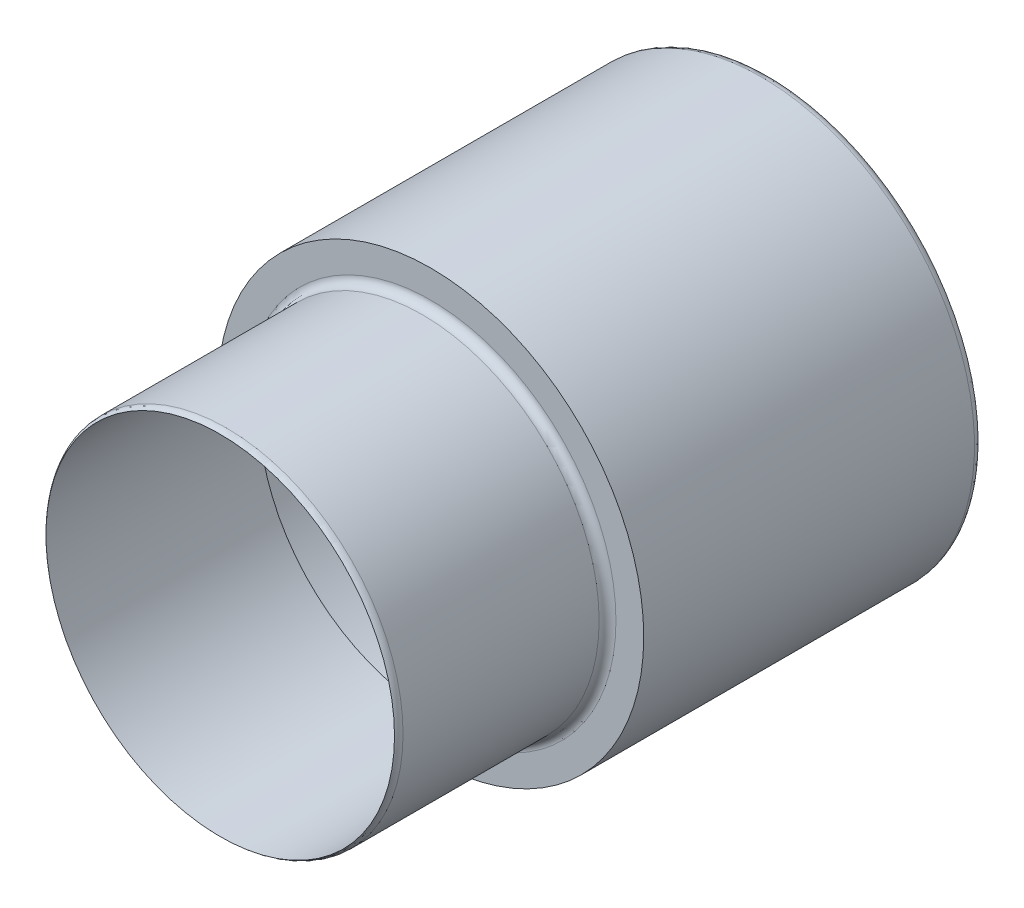
ISO-10303-21;
HEADER;
FILE_DESCRIPTION(('STEP AP214'),'2;1');
FILE_NAME('part.step','',(''),(''),'','','');
FILE_SCHEMA(('AUTOMOTIVE_DESIGN { 1 0 10303 214 1 1 1 1 }'));
ENDSEC;
DATA;
#1=APPLICATION_CONTEXT('core data for automotive mechanical design processes');
#2=APPLICATION_PROTOCOL_DEFINITION('international standard','automotive_design',2000,#1);
#3=PRODUCT_CONTEXT('',#1,'mechanical');
#4=PRODUCT('Part','Part','',(#3));
#5=PRODUCT_RELATED_PRODUCT_CATEGORY('part','',(#4));
#6=PRODUCT_DEFINITION_FORMATION('','',#4);
#7=PRODUCT_DEFINITION_CONTEXT('part definition',#1,'design');
#8=PRODUCT_DEFINITION('design','',#6,#7);
#9=PRODUCT_DEFINITION_SHAPE('','',#8);
#10=(LENGTH_UNIT() NAMED_UNIT(*) SI_UNIT(.MILLI.,.METRE.));
#11=(NAMED_UNIT(*) PLANE_ANGLE_UNIT() SI_UNIT($,.RADIAN.));
#12=(NAMED_UNIT(*) SI_UNIT($,.STERADIAN.) SOLID_ANGLE_UNIT());
#13=UNCERTAINTY_MEASURE_WITH_UNIT(LENGTH_MEASURE(1.E-05),#10,'distance_accuracy_value','');
#14=(GEOMETRIC_REPRESENTATION_CONTEXT(3) GLOBAL_UNCERTAINTY_ASSIGNED_CONTEXT((#13)) GLOBAL_UNIT_ASSIGNED_CONTEXT((#10,
#11,#12)) REPRESENTATION_CONTEXT('',''));
#15=CARTESIAN_POINT('',(0.,0.,0.));
#16=DIRECTION('',(0.,0.,1.));
#17=DIRECTION('',(1.,0.,0.));
#18=AXIS2_PLACEMENT_3D('',#15,#16,#17);
#19=CARTESIAN_POINT('',(0.,0.,400.));
#20=DIRECTION('',(0.,0.,-1.));
#21=DIRECTION('',(-1.,0.,0.));
#22=AXIS2_PLACEMENT_3D('',#19,#20,#21);
#23=CYLINDRICAL_SURFACE('',#22,253.);
#24=CARTESIAN_POINT('',(0.,0.,7.14142842854282));
#25=DIRECTION('',(0.,0.,-1.));
#26=DIRECTION('',(-1.,0.,0.));
#27=AXIS2_PLACEMENT_3D('',#24,#25,#26);
#28=CIRCLE('',#27,253.);
#29=CARTESIAN_POINT('',(-253.,0.,7.14142842854282));
#30=VERTEX_POINT('',#29);
#31=EDGE_CURVE('E10',#30,#30,#28,.F.);
#32=ORIENTED_EDGE('',*,*,#31,.T.);
#33=EDGE_LOOP('',(#32));
#34=FACE_BOUND('',#33,.T.);
#35=CARTESIAN_POINT('',(0.,0.,400.));
#36=DIRECTION('',(0.,0.,1.));
#37=DIRECTION('',(1.,0.,0.));
#38=AXIS2_PLACEMENT_3D('',#35,#36,#37);
#39=CIRCLE('',#38,253.);
#40=CARTESIAN_POINT('',(253.,0.,400.));
#41=VERTEX_POINT('',#40);
#42=EDGE_CURVE('E52',#41,#41,#39,.T.);
#43=ORIENTED_EDGE('',*,*,#42,.F.);
#44=EDGE_LOOP('',(#43));
#45=FACE_BOUND('',#44,.T.);
#46=ADVANCED_FACE('F32',(#34,#45),#23,.T.);
#47=CARTESIAN_POINT('',(0.,0.,400.));
#48=DIRECTION('',(0.,0.,1.));
#49=DIRECTION('',(1.,0.,0.));
#50=AXIS2_PLACEMENT_3D('',#47,#48,#49);
#51=PLANE('',#50);
#52=CARTESIAN_POINT('',(0.,0.,400.));
#53=DIRECTION('',(0.,0.,1.));
#54=DIRECTION('',(1.,0.,0.));
#55=AXIS2_PLACEMENT_3D('',#52,#53,#54);
#56=CIRCLE('',#55,220.);
#57=CARTESIAN_POINT('',(220.,0.,400.));
#58=VERTEX_POINT('',#57);
#59=EDGE_CURVE('E39',#58,#58,#56,.F.);
#60=ORIENTED_EDGE('',*,*,#59,.T.);
#61=EDGE_LOOP('',(#60));
#62=FACE_BOUND('',#61,.T.);
#63=ORIENTED_EDGE('',*,*,#42,.T.);
#64=EDGE_LOOP('',(#63));
#65=FACE_BOUND('',#64,.T.);
#66=ADVANCED_FACE('F86',(#62,#65),#51,.T.);
#67=CARTESIAN_POINT('',(0.,0.,650.));
#68=DIRECTION('',(0.,0.,-1.));
#69=DIRECTION('',(-1.,0.,0.));
#70=AXIS2_PLACEMENT_3D('',#67,#68,#69);
#71=CYLINDRICAL_SURFACE('',#70,210.);
#72=CARTESIAN_POINT('',(0.,0.,410.));
#73=DIRECTION('',(0.,0.,1.));
#74=DIRECTION('',(1.,0.,0.));
#75=AXIS2_PLACEMENT_3D('',#72,#73,#74);
#76=CIRCLE('',#75,210.);
#77=CARTESIAN_POINT('',(210.,0.,410.));
#78=VERTEX_POINT('',#77);
#79=EDGE_CURVE('E43',#78,#78,#76,.T.);
#80=ORIENTED_EDGE('',*,*,#79,.T.);
#81=EDGE_LOOP('',(#80));
#82=FACE_BOUND('',#81,.T.);
#83=CARTESIAN_POINT('',(0.,0.,642.858571571457));
#84=DIRECTION('',(0.,0.,1.));
#85=DIRECTION('',(1.,0.,0.));
#86=AXIS2_PLACEMENT_3D('',#83,#84,#85);
#87=CIRCLE('',#86,210.);
#88=CARTESIAN_POINT('',(210.,0.,642.858571571457));
#89=VERTEX_POINT('',#88);
#90=EDGE_CURVE('E47',#89,#89,#87,.F.);
#91=ORIENTED_EDGE('',*,*,#90,.T.);
#92=EDGE_LOOP('',(#91));
#93=FACE_BOUND('',#92,.T.);
#94=ADVANCED_FACE('F83',(#82,#93),#71,.T.);
#95=CARTESIAN_POINT('',(0.,0.,400.));
#96=DIRECTION('',(0.,0.,-1.));
#97=DIRECTION('',(-1.,0.,0.));
#98=AXIS2_PLACEMENT_3D('',#95,#96,#97);
#99=CYLINDRICAL_SURFACE('',#98,250.);
#100=CARTESIAN_POINT('',(0.,0.,397.));
#101=DIRECTION('',(0.,0.,1.));
#102=DIRECTION('',(1.,0.,0.));
#103=AXIS2_PLACEMENT_3D('',#100,#101,#102);
#104=CIRCLE('',#103,250.);
#105=CARTESIAN_POINT('',(250.,0.,397.));
#106=VERTEX_POINT('',#105);
#107=EDGE_CURVE('E62',#106,#106,#104,.T.);
#108=ORIENTED_EDGE('',*,*,#107,.T.);
#109=EDGE_LOOP('',(#108));
#110=FACE_BOUND('',#109,.T.);
#111=CARTESIAN_POINT('',(0.,0.,0.));
#112=DIRECTION('',(0.,0.,1.));
#113=DIRECTION('',(1.,0.,0.));
#114=AXIS2_PLACEMENT_3D('',#111,#112,#113);
#115=CIRCLE('',#114,250.);
#116=CARTESIAN_POINT('',(250.,0.,0.));
#117=VERTEX_POINT('',#116);
#118=EDGE_CURVE('E59',#117,#117,#115,.T.);
#119=ORIENTED_EDGE('',*,*,#118,.F.);
#120=EDGE_LOOP('',(#119));
#121=FACE_BOUND('',#120,.T.);
#122=ADVANCED_FACE('F68',(#110,#121),#99,.F.);
#123=CARTESIAN_POINT('',(0.,0.,397.));
#124=DIRECTION('',(0.,0.,1.));
#125=DIRECTION('',(1.,0.,0.));
#126=AXIS2_PLACEMENT_3D('',#123,#124,#125);
#127=PLANE('',#126);
#128=CARTESIAN_POINT('',(0.,0.,397.));
#129=DIRECTION('',(0.,0.,1.));
#130=DIRECTION('',(1.,0.,0.));
#131=AXIS2_PLACEMENT_3D('',#128,#129,#130);
#132=CIRCLE('',#131,207.);
#133=CARTESIAN_POINT('',(207.,0.,397.));
#134=VERTEX_POINT('',#133);
#135=EDGE_CURVE('E55',#134,#134,#132,.T.);
#136=ORIENTED_EDGE('',*,*,#135,.T.);
#137=EDGE_LOOP('',(#136));
#138=FACE_BOUND('',#137,.T.);
#139=ORIENTED_EDGE('',*,*,#107,.F.);
#140=EDGE_LOOP('',(#139));
#141=FACE_BOUND('',#140,.T.);
#142=ADVANCED_FACE('F71',(#138,#141),#127,.F.);
#143=CARTESIAN_POINT('',(0.,0.,650.));
#144=DIRECTION('',(0.,0.,-1.));
#145=DIRECTION('',(-1.,0.,0.));
#146=AXIS2_PLACEMENT_3D('',#143,#144,#145);
#147=CYLINDRICAL_SURFACE('',#146,207.);
#148=CARTESIAN_POINT('',(0.,0.,650.));
#149=DIRECTION('',(0.,0.,1.));
#150=DIRECTION('',(1.,0.,0.));
#151=AXIS2_PLACEMENT_3D('',#148,#149,#150);
#152=CIRCLE('',#151,207.);
#153=CARTESIAN_POINT('',(207.,0.,650.));
#154=VERTEX_POINT('',#153);
#155=EDGE_CURVE('E56',#154,#154,#152,.T.);
#156=ORIENTED_EDGE('',*,*,#155,.T.);
#157=EDGE_LOOP('',(#156));
#158=FACE_BOUND('',#157,.T.);
#159=ORIENTED_EDGE('',*,*,#135,.F.);
#160=EDGE_LOOP('',(#159));
#161=FACE_BOUND('',#160,.T.);
#162=ADVANCED_FACE('F73',(#158,#161),#147,.F.);
#163=CARTESIAN_POINT('',(0.,0.,410.));
#164=DIRECTION('',(0.,0.,1.));
#165=DIRECTION('',(1.,0.,0.));
#166=AXIS2_PLACEMENT_3D('',#163,#164,#165);
#167=TOROIDAL_SURFACE('',#166,220.,10.);
#168=ORIENTED_EDGE('',*,*,#59,.F.);
#169=EDGE_LOOP('',(#168));
#170=FACE_BOUND('',#169,.T.);
#171=ORIENTED_EDGE('',*,*,#79,.F.);
#172=EDGE_LOOP('',(#171));
#173=FACE_BOUND('',#172,.T.);
#174=ADVANCED_FACE('F80',(#170,#173),#167,.F.);
#175=CARTESIAN_POINT('',(0.,0.,642.858571571457));
#176=DIRECTION('',(0.,0.,1.));
#177=DIRECTION('',(1.,0.,0.));
#178=AXIS2_PLACEMENT_3D('',#175,#176,#177);
#179=TOROIDAL_SURFACE('',#178,200.,10.);
#180=ORIENTED_EDGE('',*,*,#90,.F.);
#181=EDGE_LOOP('',(#180));
#182=FACE_BOUND('',#181,.T.);
#183=ORIENTED_EDGE('',*,*,#155,.F.);
#184=EDGE_LOOP('',(#183));
#185=FACE_BOUND('',#184,.T.);
#186=ADVANCED_FACE('F96',(#182,#185),#179,.T.);
#187=CARTESIAN_POINT('',(0.,0.,7.14142842854284));
#188=DIRECTION('',(0.,0.,-1.));
#189=DIRECTION('',(-1.,0.,0.));
#190=AXIS2_PLACEMENT_3D('',#187,#188,#189);
#191=TOROIDAL_SURFACE('',#190,243.,10.);
#192=ORIENTED_EDGE('',*,*,#118,.T.);
#193=EDGE_LOOP('',(#192));
#194=FACE_BOUND('',#193,.T.);
#195=ORIENTED_EDGE('',*,*,#31,.F.);
#196=EDGE_LOOP('',(#195));
#197=FACE_BOUND('',#196,.T.);
#198=ADVANCED_FACE('F34',(#194,#197),#191,.T.);
#199=CLOSED_SHELL('',(#46,#66,#94,#122,#142,#162,#174,#186,#198));
#200=MANIFOLD_SOLID_BREP('B2',#199);
#201=ADVANCED_BREP_SHAPE_REPRESENTATION('',(#18,#200),#14);
#202=SHAPE_DEFINITION_REPRESENTATION(#9,#201);
ENDSEC;
END-ISO-10303-21;
